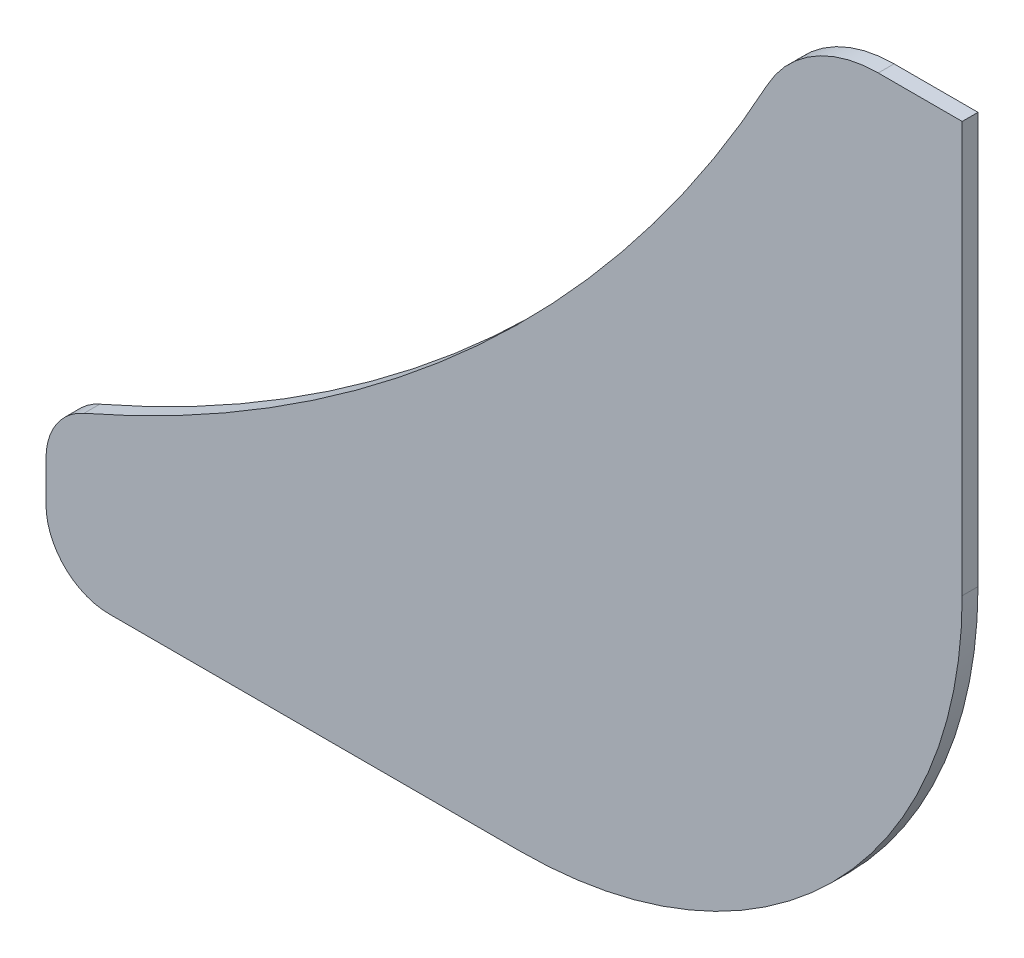
ISO-10303-21;
HEADER;
FILE_DESCRIPTION(('STEP AP214'),'2;1');
FILE_NAME('part.step','',(''),(''),'','','');
FILE_SCHEMA(('AUTOMOTIVE_DESIGN { 1 0 10303 214 1 1 1 1 }'));
ENDSEC;
DATA;
#1=APPLICATION_CONTEXT('core data for automotive mechanical design processes');
#2=APPLICATION_PROTOCOL_DEFINITION('international standard','automotive_design',2000,#1);
#3=PRODUCT_CONTEXT('',#1,'mechanical');
#4=PRODUCT('Part','Part','',(#3));
#5=PRODUCT_RELATED_PRODUCT_CATEGORY('part','',(#4));
#6=PRODUCT_DEFINITION_FORMATION('','',#4);
#7=PRODUCT_DEFINITION_CONTEXT('part definition',#1,'design');
#8=PRODUCT_DEFINITION('design','',#6,#7);
#9=PRODUCT_DEFINITION_SHAPE('','',#8);
#10=(LENGTH_UNIT() NAMED_UNIT(*) SI_UNIT(.MILLI.,.METRE.));
#11=(NAMED_UNIT(*) PLANE_ANGLE_UNIT() SI_UNIT($,.RADIAN.));
#12=(NAMED_UNIT(*) SI_UNIT($,.STERADIAN.) SOLID_ANGLE_UNIT());
#13=UNCERTAINTY_MEASURE_WITH_UNIT(LENGTH_MEASURE(1.E-05),#10,'distance_accuracy_value','');
#14=(GEOMETRIC_REPRESENTATION_CONTEXT(3) GLOBAL_UNCERTAINTY_ASSIGNED_CONTEXT((#13)) GLOBAL_UNIT_ASSIGNED_CONTEXT((#10,
#11,#12)) REPRESENTATION_CONTEXT('',''));
#15=CARTESIAN_POINT('',(0.,0.,0.));
#16=DIRECTION('',(0.,0.,1.));
#17=DIRECTION('',(1.,0.,0.));
#18=AXIS2_PLACEMENT_3D('',#15,#16,#17);
#19=CARTESIAN_POINT('',(0.,55.88,6.35));
#20=DIRECTION('',(0.,-1.,0.));
#21=DIRECTION('',(0.,0.,-1.));
#22=AXIS2_PLACEMENT_3D('',#19,#20,#21);
#23=PLANE('',#22);
#24=DIRECTION('',(-1.,0.,0.));
#25=VECTOR('',#24,1.);
#26=CARTESIAN_POINT('',(0.,55.88,0.));
#27=LINE('',#26,#25);
#28=CARTESIAN_POINT('',(571.471225938193,55.88,0.));
#29=VERTEX_POINT('',#28);
#30=CARTESIAN_POINT('',(537.72845203506,55.88,0.));
#31=VERTEX_POINT('',#30);
#32=EDGE_CURVE('E129',#29,#31,#27,.T.);
#33=ORIENTED_EDGE('',*,*,#32,.T.);
#34=DIRECTION('',(0.,0.,-1.));
#35=VECTOR('',#34,1.);
#36=CARTESIAN_POINT('',(537.72845203506,55.88,6.35));
#37=LINE('',#36,#35);
#38=CARTESIAN_POINT('',(537.72845203506,55.88,6.35));
#39=VERTEX_POINT('',#38);
#40=EDGE_CURVE('E110',#39,#31,#37,.T.);
#41=ORIENTED_EDGE('',*,*,#40,.F.);
#42=DIRECTION('',(-1.,0.,0.));
#43=VECTOR('',#42,1.);
#44=CARTESIAN_POINT('',(0.,55.88,6.35));
#45=LINE('',#44,#43);
#46=CARTESIAN_POINT('',(571.471225938193,55.88,6.35));
#47=VERTEX_POINT('',#46);
#48=EDGE_CURVE('E116',#47,#39,#45,.T.);
#49=ORIENTED_EDGE('',*,*,#48,.F.);
#50=DIRECTION('',(0.,0.,-1.));
#51=VECTOR('',#50,1.);
#52=CARTESIAN_POINT('',(571.471225938193,55.88,6.35));
#53=LINE('',#52,#51);
#54=EDGE_CURVE('E147',#47,#29,#53,.T.);
#55=ORIENTED_EDGE('',*,*,#54,.T.);
#56=EDGE_LOOP('',(#33,#41,#49,#55));
#57=FACE_BOUND('',#56,.T.);
#58=ADVANCED_FACE('F35',(#57),#23,.F.);
#59=CARTESIAN_POINT('',(537.72845203506,5.07999999999997,6.35));
#60=DIRECTION('',(0.,0.,-1.));
#61=DIRECTION('',(-1.,0.,0.));
#62=AXIS2_PLACEMENT_3D('',#59,#60,#61);
#63=CYLINDRICAL_SURFACE('',#62,50.8000000000001);
#64=CARTESIAN_POINT('',(537.72845203506,5.07999999999997,0.));
#65=DIRECTION('',(0.,0.,1.));
#66=DIRECTION('',(1.,0.,0.));
#67=AXIS2_PLACEMENT_3D('',#64,#65,#66);
#68=CIRCLE('',#67,50.8000000000001);
#69=CARTESIAN_POINT('',(493.097424953051,29.3433761378123,0.));
#70=VERTEX_POINT('',#69);
#71=EDGE_CURVE('E162',#31,#70,#68,.T.);
#72=ORIENTED_EDGE('',*,*,#71,.T.);
#73=DIRECTION('',(0.,0.,-1.));
#74=VECTOR('',#73,1.);
#75=CARTESIAN_POINT('',(493.097424953051,29.3433761378123,6.35));
#76=LINE('',#75,#74);
#77=CARTESIAN_POINT('',(493.097424953051,29.3433761378123,6.35));
#78=VERTEX_POINT('',#77);
#79=EDGE_CURVE('E113',#78,#70,#76,.T.);
#80=ORIENTED_EDGE('',*,*,#79,.F.);
#81=CARTESIAN_POINT('',(537.72845203506,5.07999999999997,6.35));
#82=DIRECTION('',(0.,0.,1.));
#83=DIRECTION('',(1.,0.,0.));
#84=AXIS2_PLACEMENT_3D('',#81,#82,#83);
#85=CIRCLE('',#84,50.8000000000001);
#86=EDGE_CURVE('E105',#39,#78,#85,.T.);
#87=ORIENTED_EDGE('',*,*,#86,.F.);
#88=ORIENTED_EDGE('',*,*,#40,.T.);
#89=EDGE_LOOP('',(#72,#80,#87,#88));
#90=FACE_BOUND('',#89,.T.);
#91=ADVANCED_FACE('F108',(#90),#63,.T.);
#92=CARTESIAN_POINT('',(-9.93316496599256,302.812780944572,6.35));
#93=DIRECTION('',(0.,0.,-1.));
#94=DIRECTION('',(-1.,0.,0.));
#95=AXIS2_PLACEMENT_3D('',#92,#93,#94);
#96=CYLINDRICAL_SURFACE('',#95,572.560293558385);
#97=CARTESIAN_POINT('',(-9.93316496599256,302.812780944572,0.));
#98=DIRECTION('',(0.,0.,1.));
#99=DIRECTION('',(1.,0.,0.));
#100=AXIS2_PLACEMENT_3D('',#97,#98,#99);
#101=CIRCLE('',#100,572.560293558385);
#102=CARTESIAN_POINT('',(218.46765098719,-222.218986695811,0.));
#103=VERTEX_POINT('',#102);
#104=EDGE_CURVE('E160',#103,#70,#101,.T.);
#105=ORIENTED_EDGE('',*,*,#104,.F.);
#106=DIRECTION('',(0.,0.,-1.));
#107=VECTOR('',#106,1.);
#108=CARTESIAN_POINT('',(218.46765098719,-222.218986695811,6.35));
#109=LINE('',#108,#107);
#110=CARTESIAN_POINT('',(218.46765098719,-222.218986695811,6.35));
#111=VERTEX_POINT('',#110);
#112=EDGE_CURVE('E43',#103,#111,#109,.F.);
#113=ORIENTED_EDGE('',*,*,#112,.T.);
#114=CARTESIAN_POINT('',(-9.93316496599256,302.812780944572,6.35));
#115=DIRECTION('',(0.,0.,1.));
#116=DIRECTION('',(1.,0.,0.));
#117=AXIS2_PLACEMENT_3D('',#114,#115,#116);
#118=CIRCLE('',#117,572.560293558385);
#119=EDGE_CURVE('E115',#111,#78,#118,.T.);
#120=ORIENTED_EDGE('',*,*,#119,.T.);
#121=ORIENTED_EDGE('',*,*,#79,.T.);
#122=EDGE_LOOP('',(#105,#113,#120,#121));
#123=FACE_BOUND('',#122,.T.);
#124=ADVANCED_FACE('F175',(#123),#96,.F.);
#125=CARTESIAN_POINT('',(203.2,0.,6.35));
#126=DIRECTION('',(1.,0.,0.));
#127=DIRECTION('',(0.,0.,-1.));
#128=AXIS2_PLACEMENT_3D('',#125,#126,#127);
#129=PLANE('',#128);
#130=DIRECTION('',(0.,-1.,0.));
#131=VECTOR('',#130,1.);
#132=CARTESIAN_POINT('',(203.2,0.,6.35));
#133=LINE('',#132,#131);
#134=CARTESIAN_POINT('',(203.2,-245.510519566848,6.35));
#135=VERTEX_POINT('',#134);
#136=CARTESIAN_POINT('',(203.2,-261.62,6.35));
#137=VERTEX_POINT('',#136);
#138=EDGE_CURVE('E173',#135,#137,#133,.T.);
#139=ORIENTED_EDGE('',*,*,#138,.F.);
#140=DIRECTION('',(0.,0.,1.));
#141=VECTOR('',#140,1.);
#142=CARTESIAN_POINT('',(203.2,-245.510519566848,0.));
#143=LINE('',#142,#141);
#144=CARTESIAN_POINT('',(203.2,-245.510519566848,0.));
#145=VERTEX_POINT('',#144);
#146=EDGE_CURVE('E130',#135,#145,#143,.F.);
#147=ORIENTED_EDGE('',*,*,#146,.T.);
#148=DIRECTION('',(0.,-1.,0.));
#149=VECTOR('',#148,1.);
#150=CARTESIAN_POINT('',(203.2,0.,0.));
#151=LINE('',#150,#149);
#152=CARTESIAN_POINT('',(203.2,-261.62,0.));
#153=VERTEX_POINT('',#152);
#154=EDGE_CURVE('E158',#145,#153,#151,.T.);
#155=ORIENTED_EDGE('',*,*,#154,.T.);
#156=DIRECTION('',(0.,0.,-1.));
#157=VECTOR('',#156,1.);
#158=CARTESIAN_POINT('',(203.2,-261.62,6.35));
#159=LINE('',#158,#157);
#160=EDGE_CURVE('E134',#137,#153,#159,.T.);
#161=ORIENTED_EDGE('',*,*,#160,.F.);
#162=EDGE_LOOP('',(#139,#147,#155,#161));
#163=FACE_BOUND('',#162,.T.);
#164=ADVANCED_FACE('F181',(#163),#129,.F.);
#165=CARTESIAN_POINT('',(228.6,-261.62,6.35));
#166=DIRECTION('',(0.,0.,-1.));
#167=DIRECTION('',(-1.,0.,0.));
#168=AXIS2_PLACEMENT_3D('',#165,#166,#167);
#169=CYLINDRICAL_SURFACE('',#168,25.4);
#170=CARTESIAN_POINT('',(228.6,-261.62,0.));
#171=DIRECTION('',(0.,0.,1.));
#172=DIRECTION('',(1.,0.,0.));
#173=AXIS2_PLACEMENT_3D('',#170,#171,#172);
#174=CIRCLE('',#173,25.4);
#175=CARTESIAN_POINT('',(228.6,-287.02,0.));
#176=VERTEX_POINT('',#175);
#177=EDGE_CURVE('E156',#153,#176,#174,.T.);
#178=ORIENTED_EDGE('',*,*,#177,.T.);
#179=DIRECTION('',(0.,0.,-1.));
#180=VECTOR('',#179,1.);
#181=CARTESIAN_POINT('',(228.6,-287.02,6.35));
#182=LINE('',#181,#180);
#183=CARTESIAN_POINT('',(228.6,-287.02,6.35));
#184=VERTEX_POINT('',#183);
#185=EDGE_CURVE('E140',#184,#176,#182,.T.);
#186=ORIENTED_EDGE('',*,*,#185,.F.);
#187=CARTESIAN_POINT('',(228.6,-261.62,6.35));
#188=DIRECTION('',(0.,0.,1.));
#189=DIRECTION('',(1.,0.,0.));
#190=AXIS2_PLACEMENT_3D('',#187,#188,#189);
#191=CIRCLE('',#190,25.4);
#192=EDGE_CURVE('E171',#137,#184,#191,.T.);
#193=ORIENTED_EDGE('',*,*,#192,.F.);
#194=ORIENTED_EDGE('',*,*,#160,.T.);
#195=EDGE_LOOP('',(#178,#186,#193,#194));
#196=FACE_BOUND('',#195,.T.);
#197=ADVANCED_FACE('F188',(#196),#169,.T.);
#198=CARTESIAN_POINT('',(0.,-287.02,6.35));
#199=DIRECTION('',(0.,1.,0.));
#200=DIRECTION('',(-1.,0.,0.));
#201=AXIS2_PLACEMENT_3D('',#198,#199,#200);
#202=PLANE('',#201);
#203=DIRECTION('',(1.,0.,0.));
#204=VECTOR('',#203,1.);
#205=CARTESIAN_POINT('',(0.,-287.02,0.));
#206=LINE('',#205,#204);
#207=CARTESIAN_POINT('',(393.671225938193,-287.02,0.));
#208=VERTEX_POINT('',#207);
#209=EDGE_CURVE('E153',#176,#208,#206,.T.);
#210=ORIENTED_EDGE('',*,*,#209,.T.);
#211=DIRECTION('',(0.,0.,-1.));
#212=VECTOR('',#211,1.);
#213=CARTESIAN_POINT('',(393.671225938193,-287.02,6.35));
#214=LINE('',#213,#212);
#215=CARTESIAN_POINT('',(393.671225938193,-287.02,6.35));
#216=VERTEX_POINT('',#215);
#217=EDGE_CURVE('E143',#216,#208,#214,.T.);
#218=ORIENTED_EDGE('',*,*,#217,.F.);
#219=DIRECTION('',(1.,0.,0.));
#220=VECTOR('',#219,1.);
#221=CARTESIAN_POINT('',(0.,-287.02,6.35));
#222=LINE('',#221,#220);
#223=EDGE_CURVE('E169',#184,#216,#222,.T.);
#224=ORIENTED_EDGE('',*,*,#223,.F.);
#225=ORIENTED_EDGE('',*,*,#185,.T.);
#226=EDGE_LOOP('',(#210,#218,#224,#225));
#227=FACE_BOUND('',#226,.T.);
#228=ADVANCED_FACE('F192',(#227),#202,.F.);
#229=CARTESIAN_POINT('',(393.671225938193,-109.22,6.35));
#230=DIRECTION('',(0.,0.,-1.));
#231=DIRECTION('',(-1.,0.,0.));
#232=AXIS2_PLACEMENT_3D('',#229,#230,#231);
#233=CYLINDRICAL_SURFACE('',#232,177.8);
#234=CARTESIAN_POINT('',(393.671225938193,-109.22,0.));
#235=DIRECTION('',(0.,0.,1.));
#236=DIRECTION('',(1.,0.,0.));
#237=AXIS2_PLACEMENT_3D('',#234,#235,#236);
#238=CIRCLE('',#237,177.8);
#239=CARTESIAN_POINT('',(571.471225938193,-109.22,0.));
#240=VERTEX_POINT('',#239);
#241=EDGE_CURVE('E150',#240,#208,#238,.F.);
#242=ORIENTED_EDGE('',*,*,#241,.F.);
#243=DIRECTION('',(0.,0.,-1.));
#244=VECTOR('',#243,1.);
#245=CARTESIAN_POINT('',(571.471225938193,-109.22,6.35));
#246=LINE('',#245,#244);
#247=CARTESIAN_POINT('',(571.471225938193,-109.22,6.35));
#248=VERTEX_POINT('',#247);
#249=EDGE_CURVE('E145',#248,#240,#246,.T.);
#250=ORIENTED_EDGE('',*,*,#249,.F.);
#251=CARTESIAN_POINT('',(393.671225938193,-109.22,6.35));
#252=DIRECTION('',(0.,0.,1.));
#253=DIRECTION('',(1.,0.,0.));
#254=AXIS2_PLACEMENT_3D('',#251,#252,#253);
#255=CIRCLE('',#254,177.8);
#256=EDGE_CURVE('E166',#248,#216,#255,.F.);
#257=ORIENTED_EDGE('',*,*,#256,.T.);
#258=ORIENTED_EDGE('',*,*,#217,.T.);
#259=EDGE_LOOP('',(#242,#250,#257,#258));
#260=FACE_BOUND('',#259,.T.);
#261=ADVANCED_FACE('F196',(#260),#233,.T.);
#262=CARTESIAN_POINT('',(571.471225938193,-3.84288620803965E-13,6.35));
#263=DIRECTION('',(-1.,0.,0.));
#264=DIRECTION('',(0.,-1.,0.));
#265=AXIS2_PLACEMENT_3D('',#262,#263,#264);
#266=PLANE('',#265);
#267=DIRECTION('',(0.,1.,0.));
#268=VECTOR('',#267,1.);
#269=CARTESIAN_POINT('',(571.471225938193,-3.84288620803965E-13,0.));
#270=LINE('',#269,#268);
#271=EDGE_CURVE('E126',#240,#29,#270,.T.);
#272=ORIENTED_EDGE('',*,*,#271,.T.);
#273=ORIENTED_EDGE('',*,*,#54,.F.);
#274=DIRECTION('',(0.,1.,0.));
#275=VECTOR('',#274,1.);
#276=CARTESIAN_POINT('',(571.471225938193,-3.84288620803965E-13,6.35));
#277=LINE('',#276,#275);
#278=EDGE_CURVE('E122',#248,#47,#277,.T.);
#279=ORIENTED_EDGE('',*,*,#278,.F.);
#280=ORIENTED_EDGE('',*,*,#249,.T.);
#281=EDGE_LOOP('',(#272,#273,#279,#280));
#282=FACE_BOUND('',#281,.T.);
#283=ADVANCED_FACE('F199',(#282),#266,.F.);
#284=CARTESIAN_POINT('',(0.,0.,6.35));
#285=DIRECTION('',(0.,0.,1.));
#286=DIRECTION('',(1.,0.,0.));
#287=AXIS2_PLACEMENT_3D('',#284,#285,#286);
#288=PLANE('',#287);
#289=ORIENTED_EDGE('',*,*,#119,.F.);
#290=CARTESIAN_POINT('',(228.6,-245.510519566848,6.35));
#291=DIRECTION('',(0.,0.,1.));
#292=DIRECTION('',(1.,0.,0.));
#293=AXIS2_PLACEMENT_3D('',#290,#291,#292);
#294=CIRCLE('',#293,25.4);
#295=EDGE_CURVE('E11',#111,#135,#294,.T.);
#296=ORIENTED_EDGE('',*,*,#295,.T.);
#297=ORIENTED_EDGE('',*,*,#138,.T.);
#298=ORIENTED_EDGE('',*,*,#192,.T.);
#299=ORIENTED_EDGE('',*,*,#223,.T.);
#300=ORIENTED_EDGE('',*,*,#256,.F.);
#301=ORIENTED_EDGE('',*,*,#278,.T.);
#302=ORIENTED_EDGE('',*,*,#48,.T.);
#303=ORIENTED_EDGE('',*,*,#86,.T.);
#304=EDGE_LOOP('',(#289,#296,#297,#298,#299,#300,#301,#302,#303));
#305=FACE_BOUND('',#304,.T.);
#306=ADVANCED_FACE('F119',(#305),#288,.T.);
#307=CARTESIAN_POINT('',(0.,0.,0.));
#308=DIRECTION('',(0.,0.,1.));
#309=DIRECTION('',(1.,0.,0.));
#310=AXIS2_PLACEMENT_3D('',#307,#308,#309);
#311=PLANE('',#310);
#312=ORIENTED_EDGE('',*,*,#154,.F.);
#313=CARTESIAN_POINT('',(228.6,-245.510519566848,0.));
#314=DIRECTION('',(0.,0.,1.));
#315=DIRECTION('',(1.,0.,0.));
#316=AXIS2_PLACEMENT_3D('',#313,#314,#315);
#317=CIRCLE('',#316,25.4);
#318=EDGE_CURVE('E57',#145,#103,#317,.F.);
#319=ORIENTED_EDGE('',*,*,#318,.T.);
#320=ORIENTED_EDGE('',*,*,#104,.T.);
#321=ORIENTED_EDGE('',*,*,#71,.F.);
#322=ORIENTED_EDGE('',*,*,#32,.F.);
#323=ORIENTED_EDGE('',*,*,#271,.F.);
#324=ORIENTED_EDGE('',*,*,#241,.T.);
#325=ORIENTED_EDGE('',*,*,#209,.F.);
#326=ORIENTED_EDGE('',*,*,#177,.F.);
#327=EDGE_LOOP('',(#312,#319,#320,#321,#322,#323,#324,#325,#326));
#328=FACE_BOUND('',#327,.T.);
#329=ADVANCED_FACE('F184',(#328),#311,.F.);
#330=CARTESIAN_POINT('',(228.6,-245.510519566848,6.35));
#331=DIRECTION('',(0.,0.,-1.));
#332=DIRECTION('',(-1.,0.,0.));
#333=AXIS2_PLACEMENT_3D('',#330,#331,#332);
#334=CYLINDRICAL_SURFACE('',#333,25.4);
#335=ORIENTED_EDGE('',*,*,#295,.F.);
#336=ORIENTED_EDGE('',*,*,#112,.F.);
#337=ORIENTED_EDGE('',*,*,#318,.F.);
#338=ORIENTED_EDGE('',*,*,#146,.F.);
#339=EDGE_LOOP('',(#335,#336,#337,#338));
#340=FACE_BOUND('',#339,.T.);
#341=ADVANCED_FACE('F37',(#340),#334,.T.);
#342=CLOSED_SHELL('',(#58,#91,#124,#164,#197,#228,#261,#283,#306,#329,#341));
#343=MANIFOLD_SOLID_BREP('B2',#342);
#344=ADVANCED_BREP_SHAPE_REPRESENTATION('',(#18,#343),#14);
#345=SHAPE_DEFINITION_REPRESENTATION(#9,#344);
ENDSEC;
END-ISO-10303-21;
